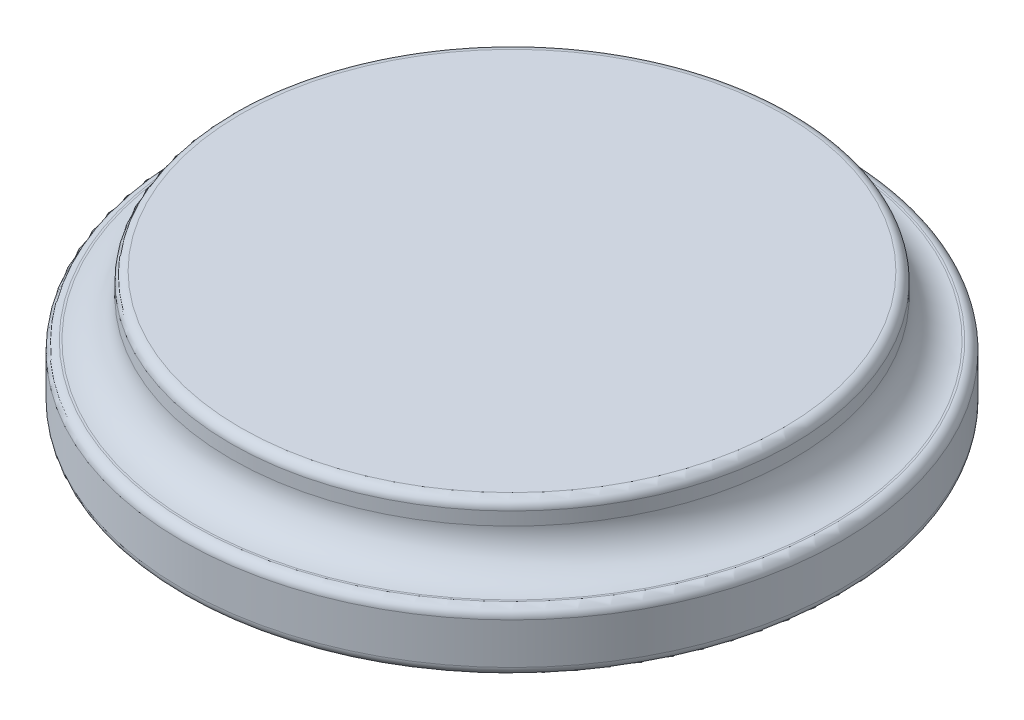
ISO-10303-21;
HEADER;
FILE_DESCRIPTION(('STEP AP214'),'2;1');
FILE_NAME('part.step','',(''),(''),'','','');
FILE_SCHEMA(('AUTOMOTIVE_DESIGN { 1 0 10303 214 1 1 1 1 }'));
ENDSEC;
DATA;
#1=APPLICATION_CONTEXT('core data for automotive mechanical design processes');
#2=APPLICATION_PROTOCOL_DEFINITION('international standard','automotive_design',2000,#1);
#3=PRODUCT_CONTEXT('',#1,'mechanical');
#4=PRODUCT('Part','Part','',(#3));
#5=PRODUCT_RELATED_PRODUCT_CATEGORY('part','',(#4));
#6=PRODUCT_DEFINITION_FORMATION('','',#4);
#7=PRODUCT_DEFINITION_CONTEXT('part definition',#1,'design');
#8=PRODUCT_DEFINITION('design','',#6,#7);
#9=PRODUCT_DEFINITION_SHAPE('','',#8);
#10=(LENGTH_UNIT() NAMED_UNIT(*) SI_UNIT(.MILLI.,.METRE.));
#11=(NAMED_UNIT(*) PLANE_ANGLE_UNIT() SI_UNIT($,.RADIAN.));
#12=(NAMED_UNIT(*) SI_UNIT($,.STERADIAN.) SOLID_ANGLE_UNIT());
#13=UNCERTAINTY_MEASURE_WITH_UNIT(LENGTH_MEASURE(1.E-05),#10,'distance_accuracy_value','');
#14=(GEOMETRIC_REPRESENTATION_CONTEXT(3) GLOBAL_UNCERTAINTY_ASSIGNED_CONTEXT((#13)) GLOBAL_UNIT_ASSIGNED_CONTEXT((#10,
#11,#12)) REPRESENTATION_CONTEXT('',''));
#15=CARTESIAN_POINT('',(0.,0.,0.));
#16=DIRECTION('',(0.,0.,1.));
#17=DIRECTION('',(1.,0.,0.));
#18=AXIS2_PLACEMENT_3D('',#15,#16,#17);
#19=CARTESIAN_POINT('',(0.,3.2,0.));
#20=DIRECTION('',(0.,-1.,0.));
#21=DIRECTION('',(0.,0.,-1.));
#22=AXIS2_PLACEMENT_3D('',#19,#20,#21);
#23=CYLINDRICAL_SURFACE('',#22,17.6);
#24=CARTESIAN_POINT('',(0.,0.5,0.));
#25=DIRECTION('',(0.,1.,0.));
#26=DIRECTION('',(0.,0.,1.));
#27=AXIS2_PLACEMENT_3D('',#24,#25,#26);
#28=CIRCLE('',#27,17.6);
#29=CARTESIAN_POINT('',(0.,0.5,17.6));
#30=VERTEX_POINT('',#29);
#31=EDGE_CURVE('E38',#30,#30,#28,.T.);
#32=ORIENTED_EDGE('',*,*,#31,.T.);
#33=EDGE_LOOP('',(#32));
#34=FACE_BOUND('',#33,.T.);
#35=CARTESIAN_POINT('',(0.,2.7,0.));
#36=DIRECTION('',(0.,1.,0.));
#37=DIRECTION('',(0.,0.,1.));
#38=AXIS2_PLACEMENT_3D('',#35,#36,#37);
#39=CIRCLE('',#38,17.6);
#40=CARTESIAN_POINT('',(0.,2.7,17.6));
#41=VERTEX_POINT('',#40);
#42=EDGE_CURVE('E42',#41,#41,#39,.F.);
#43=ORIENTED_EDGE('',*,*,#42,.T.);
#44=EDGE_LOOP('',(#43));
#45=FACE_BOUND('',#44,.T.);
#46=ADVANCED_FACE('F31',(#34,#45),#23,.T.);
#47=CARTESIAN_POINT('',(0.,3.2,0.));
#48=DIRECTION('',(0.,1.,0.));
#49=DIRECTION('',(0.,0.,1.));
#50=AXIS2_PLACEMENT_3D('',#47,#48,#49);
#51=PLANE('',#50);
#52=CARTESIAN_POINT('',(0.,3.2,0.));
#53=DIRECTION('',(0.,1.,0.));
#54=DIRECTION('',(0.,0.,1.));
#55=AXIS2_PLACEMENT_3D('',#52,#53,#54);
#56=CIRCLE('',#55,17.1);
#57=CARTESIAN_POINT('',(0.,3.2,17.1));
#58=VERTEX_POINT('',#57);
#59=EDGE_CURVE('E46',#58,#58,#56,.T.);
#60=ORIENTED_EDGE('',*,*,#59,.T.);
#61=EDGE_LOOP('',(#60));
#62=FACE_BOUND('',#61,.T.);
#63=CARTESIAN_POINT('',(0.,3.2,0.));
#64=DIRECTION('',(0.,1.,0.));
#65=DIRECTION('',(0.,0.,1.));
#66=AXIS2_PLACEMENT_3D('',#63,#64,#65);
#67=CIRCLE('',#66,17.);
#68=CARTESIAN_POINT('',(0.,3.2,17.));
#69=VERTEX_POINT('',#68);
#70=EDGE_CURVE('E57',#69,#69,#67,.F.);
#71=ORIENTED_EDGE('',*,*,#70,.T.);
#72=EDGE_LOOP('',(#71));
#73=FACE_BOUND('',#72,.T.);
#74=ADVANCED_FACE('F84',(#62,#73),#51,.T.);
#75=CARTESIAN_POINT('',(0.,0.,0.));
#76=DIRECTION('',(0.,1.,0.));
#77=DIRECTION('',(0.,0.,1.));
#78=AXIS2_PLACEMENT_3D('',#75,#76,#77);
#79=PLANE('',#78);
#80=CARTESIAN_POINT('',(0.,0.,0.));
#81=DIRECTION('',(0.,1.,0.));
#82=DIRECTION('',(0.,0.,1.));
#83=AXIS2_PLACEMENT_3D('',#80,#81,#82);
#84=CIRCLE('',#83,17.1);
#85=CARTESIAN_POINT('',(0.,0.,17.1));
#86=VERTEX_POINT('',#85);
#87=EDGE_CURVE('E10',#86,#86,#84,.F.);
#88=ORIENTED_EDGE('',*,*,#87,.T.);
#89=EDGE_LOOP('',(#88));
#90=FACE_BOUND('',#89,.T.);
#91=ADVANCED_FACE('F88',(#90),#79,.F.);
#92=CARTESIAN_POINT('',(0.,6.4,0.));
#93=DIRECTION('',(0.,-1.,0.));
#94=DIRECTION('',(0.,0.,-1.));
#95=AXIS2_PLACEMENT_3D('',#92,#93,#94);
#96=CYLINDRICAL_SURFACE('',#95,15.);
#97=CARTESIAN_POINT('',(0.,5.9,0.));
#98=DIRECTION('',(0.,1.,0.));
#99=DIRECTION('',(0.,0.,1.));
#100=AXIS2_PLACEMENT_3D('',#97,#98,#99);
#101=CIRCLE('',#100,15.);
#102=CARTESIAN_POINT('',(0.,5.9,15.));
#103=VERTEX_POINT('',#102);
#104=EDGE_CURVE('E51',#103,#103,#101,.F.);
#105=ORIENTED_EDGE('',*,*,#104,.T.);
#106=EDGE_LOOP('',(#105));
#107=FACE_BOUND('',#106,.T.);
#108=CARTESIAN_POINT('',(0.,5.2,0.));
#109=DIRECTION('',(0.,1.,0.));
#110=DIRECTION('',(0.,0.,1.));
#111=AXIS2_PLACEMENT_3D('',#108,#109,#110);
#112=CIRCLE('',#111,15.);
#113=CARTESIAN_POINT('',(0.,5.2,15.));
#114=VERTEX_POINT('',#113);
#115=EDGE_CURVE('E60',#114,#114,#112,.T.);
#116=ORIENTED_EDGE('',*,*,#115,.T.);
#117=EDGE_LOOP('',(#116));
#118=FACE_BOUND('',#117,.T.);
#119=ADVANCED_FACE('F64',(#107,#118),#96,.T.);
#120=CARTESIAN_POINT('',(0.,6.4,0.));
#121=DIRECTION('',(0.,1.,0.));
#122=DIRECTION('',(0.,0.,1.));
#123=AXIS2_PLACEMENT_3D('',#120,#121,#122);
#124=PLANE('',#123);
#125=CARTESIAN_POINT('',(0.,6.4,0.));
#126=DIRECTION('',(0.,1.,0.));
#127=DIRECTION('',(0.,0.,1.));
#128=AXIS2_PLACEMENT_3D('',#125,#126,#127);
#129=CIRCLE('',#128,14.5);
#130=CARTESIAN_POINT('',(0.,6.4,14.5));
#131=VERTEX_POINT('',#130);
#132=EDGE_CURVE('E54',#131,#131,#129,.T.);
#133=ORIENTED_EDGE('',*,*,#132,.T.);
#134=EDGE_LOOP('',(#133));
#135=FACE_BOUND('',#134,.T.);
#136=ADVANCED_FACE('F69',(#135),#124,.T.);
#137=CARTESIAN_POINT('',(0.,5.2,0.));
#138=DIRECTION('',(0.,1.,0.));
#139=DIRECTION('',(0.,0.,1.));
#140=AXIS2_PLACEMENT_3D('',#137,#138,#139);
#141=TOROIDAL_SURFACE('',#140,17.,2.);
#142=ORIENTED_EDGE('',*,*,#70,.F.);
#143=EDGE_LOOP('',(#142));
#144=FACE_BOUND('',#143,.T.);
#145=ORIENTED_EDGE('',*,*,#115,.F.);
#146=EDGE_LOOP('',(#145));
#147=FACE_BOUND('',#146,.T.);
#148=ADVANCED_FACE('F66',(#144,#147),#141,.F.);
#149=CARTESIAN_POINT('',(0.,5.9,0.));
#150=DIRECTION('',(0.,1.,0.));
#151=DIRECTION('',(0.,0.,1.));
#152=AXIS2_PLACEMENT_3D('',#149,#150,#151);
#153=TOROIDAL_SURFACE('',#152,14.5,0.5);
#154=ORIENTED_EDGE('',*,*,#104,.F.);
#155=EDGE_LOOP('',(#154));
#156=FACE_BOUND('',#155,.T.);
#157=ORIENTED_EDGE('',*,*,#132,.F.);
#158=EDGE_LOOP('',(#157));
#159=FACE_BOUND('',#158,.T.);
#160=ADVANCED_FACE('F68',(#156,#159),#153,.T.);
#161=CARTESIAN_POINT('',(0.,2.7,0.));
#162=DIRECTION('',(0.,1.,0.));
#163=DIRECTION('',(0.,0.,1.));
#164=AXIS2_PLACEMENT_3D('',#161,#162,#163);
#165=TOROIDAL_SURFACE('',#164,17.1,0.5);
#166=ORIENTED_EDGE('',*,*,#42,.F.);
#167=EDGE_LOOP('',(#166));
#168=FACE_BOUND('',#167,.T.);
#169=ORIENTED_EDGE('',*,*,#59,.F.);
#170=EDGE_LOOP('',(#169));
#171=FACE_BOUND('',#170,.T.);
#172=ADVANCED_FACE('F76',(#168,#171),#165,.T.);
#173=CARTESIAN_POINT('',(0.,0.5,0.));
#174=DIRECTION('',(0.,1.,0.));
#175=DIRECTION('',(0.,0.,1.));
#176=AXIS2_PLACEMENT_3D('',#173,#174,#175);
#177=TOROIDAL_SURFACE('',#176,17.1,0.5);
#178=ORIENTED_EDGE('',*,*,#87,.F.);
#179=EDGE_LOOP('',(#178));
#180=FACE_BOUND('',#179,.T.);
#181=ORIENTED_EDGE('',*,*,#31,.F.);
#182=EDGE_LOOP('',(#181));
#183=FACE_BOUND('',#182,.T.);
#184=ADVANCED_FACE('F33',(#180,#183),#177,.T.);
#185=CLOSED_SHELL('',(#46,#74,#91,#119,#136,#148,#160,#172,#184));
#186=MANIFOLD_SOLID_BREP('B2',#185);
#187=ADVANCED_BREP_SHAPE_REPRESENTATION('',(#18,#186),#14);
#188=SHAPE_DEFINITION_REPRESENTATION(#9,#187);
ENDSEC;
END-ISO-10303-21;
